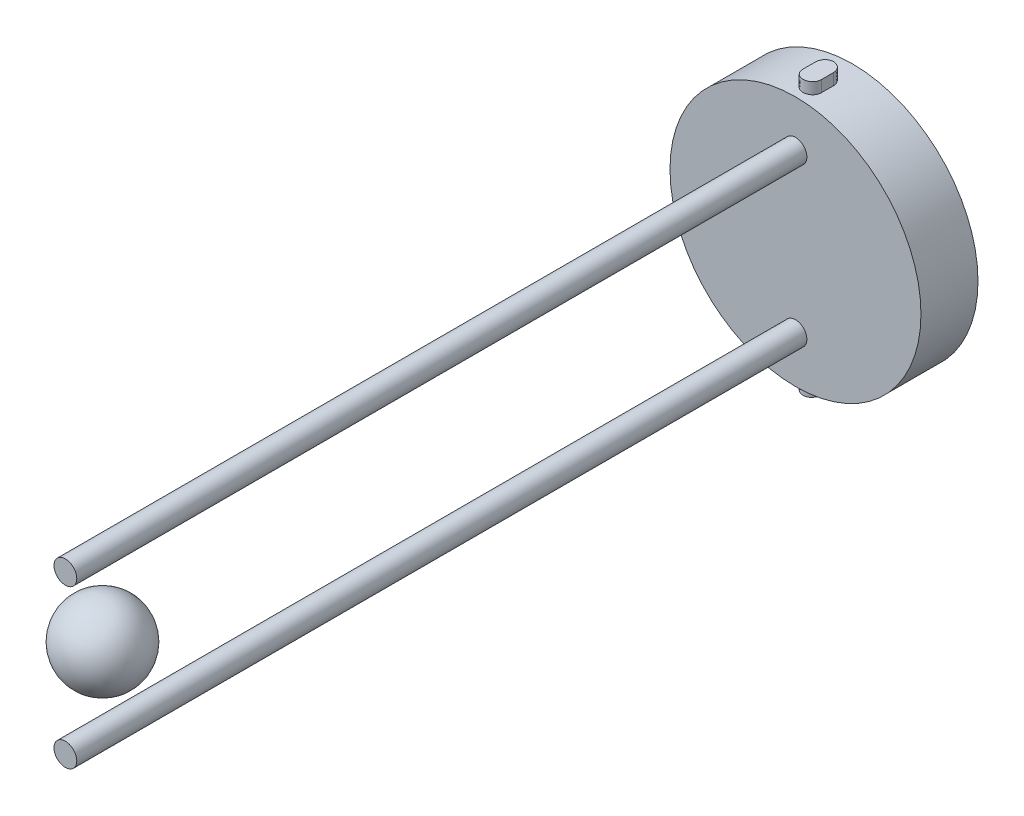
ISO-10303-21;
HEADER;
FILE_DESCRIPTION(('STEP AP214'),'2;1');
FILE_NAME('part.step','',(''),(''),'','','');
FILE_SCHEMA(('AUTOMOTIVE_DESIGN { 1 0 10303 214 1 1 1 1 }'));
ENDSEC;
DATA;
#1=APPLICATION_CONTEXT('core data for automotive mechanical design processes');
#2=APPLICATION_PROTOCOL_DEFINITION('international standard','automotive_design',2000,#1);
#3=PRODUCT_CONTEXT('',#1,'mechanical');
#4=PRODUCT('Part','Part','',(#3));
#5=PRODUCT_RELATED_PRODUCT_CATEGORY('part','',(#4));
#6=PRODUCT_DEFINITION_FORMATION('','',#4);
#7=PRODUCT_DEFINITION_CONTEXT('part definition',#1,'design');
#8=PRODUCT_DEFINITION('design','',#6,#7);
#9=PRODUCT_DEFINITION_SHAPE('','',#8);
#10=(LENGTH_UNIT() NAMED_UNIT(*) SI_UNIT(.MILLI.,.METRE.));
#11=(NAMED_UNIT(*) PLANE_ANGLE_UNIT() SI_UNIT($,.RADIAN.));
#12=(NAMED_UNIT(*) SI_UNIT($,.STERADIAN.) SOLID_ANGLE_UNIT());
#13=UNCERTAINTY_MEASURE_WITH_UNIT(LENGTH_MEASURE(1.E-05),#10,'distance_accuracy_value','');
#14=(GEOMETRIC_REPRESENTATION_CONTEXT(3) GLOBAL_UNCERTAINTY_ASSIGNED_CONTEXT((#13)) GLOBAL_UNIT_ASSIGNED_CONTEXT((#10,
#11,#12)) REPRESENTATION_CONTEXT('',''));
#15=CARTESIAN_POINT('',(0.,0.,0.));
#16=DIRECTION('',(0.,0.,1.));
#17=DIRECTION('',(1.,0.,0.));
#18=AXIS2_PLACEMENT_3D('',#15,#16,#17);
#19=CARTESIAN_POINT('',(0.,0.,303.742089952953));
#20=DIRECTION('',(0.,1.,0.));
#21=DIRECTION('',(0.,0.,-1.));
#22=AXIS2_PLACEMENT_3D('',#19,#20,#21);
#23=SPHERICAL_SURFACE('',#22,17.5);
#24=CARTESIAN_POINT('',(0.,17.5,303.742089952953));
#25=VERTEX_POINT('',#24);
#26=VERTEX_LOOP('',#25);
#27=FACE_BOUND('',#26,.T.);
#28=ADVANCED_FACE('F56',(#27),#23,.T.);
#29=CLOSED_SHELL('',(#28));
#30=MANIFOLD_SOLID_BREP('B2',#29);
#31=CARTESIAN_POINT('',(0.,34.6,320.));
#32=DIRECTION('',(0.,0.,-1.));
#33=DIRECTION('',(-1.,0.,0.));
#34=AXIS2_PLACEMENT_3D('',#31,#32,#33);
#35=CYLINDRICAL_SURFACE('',#34,5.);
#36=CARTESIAN_POINT('',(0.,34.6,320.));
#37=DIRECTION('',(0.,0.,1.));
#38=DIRECTION('',(1.,0.,0.));
#39=AXIS2_PLACEMENT_3D('',#36,#37,#38);
#40=CIRCLE('',#39,5.);
#41=CARTESIAN_POINT('',(5.,34.6,320.));
#42=VERTEX_POINT('',#41);
#43=EDGE_CURVE('E81',#42,#42,#40,.T.);
#44=ORIENTED_EDGE('',*,*,#43,.F.);
#45=EDGE_LOOP('',(#44));
#46=FACE_BOUND('',#45,.T.);
#47=CARTESIAN_POINT('',(0.,34.6,0.));
#48=DIRECTION('',(0.,0.,1.));
#49=DIRECTION('',(1.,0.,0.));
#50=AXIS2_PLACEMENT_3D('',#47,#48,#49);
#51=CIRCLE('',#50,5.);
#52=CARTESIAN_POINT('',(5.,34.6,0.));
#53=VERTEX_POINT('',#52);
#54=EDGE_CURVE('E55',#53,#53,#51,.T.);
#55=ORIENTED_EDGE('',*,*,#54,.T.);
#56=EDGE_LOOP('',(#55));
#57=FACE_BOUND('',#56,.T.);
#58=ADVANCED_FACE('F77',(#46,#57),#35,.T.);
#59=CARTESIAN_POINT('',(0.,34.6,320.));
#60=DIRECTION('',(0.,0.,1.));
#61=DIRECTION('',(1.,0.,0.));
#62=AXIS2_PLACEMENT_3D('',#59,#60,#61);
#63=PLANE('',#62);
#64=ORIENTED_EDGE('',*,*,#43,.T.);
#65=EDGE_LOOP('',(#64));
#66=FACE_BOUND('',#65,.T.);
#67=ADVANCED_FACE('F79',(#66),#63,.T.);
#68=CARTESIAN_POINT('',(0.,34.6,0.));
#69=DIRECTION('',(0.,0.,1.));
#70=DIRECTION('',(1.,0.,0.));
#71=AXIS2_PLACEMENT_3D('',#68,#69,#70);
#72=PLANE('',#71);
#73=ORIENTED_EDGE('',*,*,#54,.F.);
#74=EDGE_LOOP('',(#73));
#75=FACE_BOUND('',#74,.T.);
#76=ADVANCED_FACE('F96',(#75),#72,.F.);
#77=CLOSED_SHELL('',(#58,#67,#76));
#78=MANIFOLD_SOLID_BREP('B6',#77);
#79=CARTESIAN_POINT('',(0.,-34.6,320.));
#80=DIRECTION('',(0.,0.,-1.));
#81=DIRECTION('',(-1.,0.,0.));
#82=AXIS2_PLACEMENT_3D('',#79,#80,#81);
#83=CYLINDRICAL_SURFACE('',#82,5.);
#84=CARTESIAN_POINT('',(0.,-34.6,320.));
#85=DIRECTION('',(0.,0.,1.));
#86=DIRECTION('',(1.,0.,0.));
#87=AXIS2_PLACEMENT_3D('',#84,#85,#86);
#88=CIRCLE('',#87,5.);
#89=CARTESIAN_POINT('',(5.,-34.6,320.));
#90=VERTEX_POINT('',#89);
#91=EDGE_CURVE('E76',#90,#90,#88,.T.);
#92=ORIENTED_EDGE('',*,*,#91,.F.);
#93=EDGE_LOOP('',(#92));
#94=FACE_BOUND('',#93,.T.);
#95=CARTESIAN_POINT('',(0.,-34.6,0.));
#96=DIRECTION('',(0.,0.,1.));
#97=DIRECTION('',(1.,0.,0.));
#98=AXIS2_PLACEMENT_3D('',#95,#96,#97);
#99=CIRCLE('',#98,5.);
#100=CARTESIAN_POINT('',(5.,-34.6,0.));
#101=VERTEX_POINT('',#100);
#102=EDGE_CURVE('E130',#101,#101,#99,.T.);
#103=ORIENTED_EDGE('',*,*,#102,.T.);
#104=EDGE_LOOP('',(#103));
#105=FACE_BOUND('',#104,.T.);
#106=ADVANCED_FACE('F127',(#94,#105),#83,.T.);
#107=CARTESIAN_POINT('',(0.,-34.6,320.));
#108=DIRECTION('',(0.,0.,1.));
#109=DIRECTION('',(1.,0.,0.));
#110=AXIS2_PLACEMENT_3D('',#107,#108,#109);
#111=PLANE('',#110);
#112=ORIENTED_EDGE('',*,*,#91,.T.);
#113=EDGE_LOOP('',(#112));
#114=FACE_BOUND('',#113,.T.);
#115=ADVANCED_FACE('F142',(#114),#111,.T.);
#116=CARTESIAN_POINT('',(0.,-34.6,0.));
#117=DIRECTION('',(0.,0.,1.));
#118=DIRECTION('',(1.,0.,0.));
#119=AXIS2_PLACEMENT_3D('',#116,#117,#118);
#120=PLANE('',#119);
#121=ORIENTED_EDGE('',*,*,#102,.F.);
#122=EDGE_LOOP('',(#121));
#123=FACE_BOUND('',#122,.T.);
#124=ADVANCED_FACE('F140',(#123),#120,.F.);
#125=CLOSED_SHELL('',(#106,#115,#124));
#126=MANIFOLD_SOLID_BREP('B50',#125);
#127=CARTESIAN_POINT('',(0.,0.,-25.));
#128=DIRECTION('',(0.,0.,1.));
#129=DIRECTION('',(1.,0.,0.));
#130=AXIS2_PLACEMENT_3D('',#127,#128,#129);
#131=CYLINDRICAL_SURFACE('',#130,55.);
#132=CARTESIAN_POINT('',(0.,0.,-25.));
#133=DIRECTION('',(0.,0.,1.));
#134=DIRECTION('',(1.,0.,0.));
#135=AXIS2_PLACEMENT_3D('',#132,#133,#134);
#136=CIRCLE('',#135,55.);
#137=CARTESIAN_POINT('',(55.,0.,-25.));
#138=VERTEX_POINT('',#137);
#139=EDGE_CURVE('E398',#138,#138,#136,.T.);
#140=ORIENTED_EDGE('',*,*,#139,.T.);
#141=EDGE_LOOP('',(#140));
#142=FACE_BOUND('',#141,.T.);
#143=CARTESIAN_POINT('',(0.,0.,0.));
#144=DIRECTION('',(0.,0.,1.));
#145=DIRECTION('',(1.,0.,0.));
#146=AXIS2_PLACEMENT_3D('',#143,#144,#145);
#147=CIRCLE('',#146,55.);
#148=CARTESIAN_POINT('',(55.,0.,0.));
#149=VERTEX_POINT('',#148);
#150=EDGE_CURVE('E402',#149,#149,#147,.T.);
#151=ORIENTED_EDGE('',*,*,#150,.F.);
#152=EDGE_LOOP('',(#151));
#153=FACE_BOUND('',#152,.T.);
#154=DIRECTION('',(0.,0.,1.));
#155=VECTOR('',#154,1.);
#156=CARTESIAN_POINT('',(-4.,54.8543526076099,-25.));
#157=LINE('',#156,#155);
#158=CARTESIAN_POINT('',(-4.,54.8543526076099,-12.7));
#159=VERTEX_POINT('',#158);
#160=CARTESIAN_POINT('',(-4.,54.8543526076099,-7.3));
#161=VERTEX_POINT('',#160);
#162=EDGE_CURVE('E404',#159,#161,#157,.T.);
#163=ORIENTED_EDGE('',*,*,#162,.F.);
#164=CARTESIAN_POINT('',(-4.,54.8543526076099,-12.7));
#165=CARTESIAN_POINT('',(-4.00000056672415,54.8543504774455,-12.8126722163692));
#166=CARTESIAN_POINT('',(-3.99507121010974,54.8547122485377,-12.9252808662775));
#167=CARTESIAN_POINT('',(-3.97557866569771,54.8561292418757,-13.1496251797999));
#168=CARTESIAN_POINT('',(-3.96101836611814,54.8571842562245,-13.2613610949768));
#169=CARTESIAN_POINT('',(-3.90323107735579,54.8613375963018,-13.594210147639));
#170=CARTESIAN_POINT('',(-3.84589756430043,54.8654242388308,-13.8129985510018));
#171=CARTESIAN_POINT('',(-3.69600970860131,54.8757240821392,-14.2378328671244));
#172=CARTESIAN_POINT('',(-3.60349067054277,54.8819351506773,-14.4438913127874));
#173=CARTESIAN_POINT('',(-3.44032675306294,54.8923226553671,-14.7391483445261));
#174=CARTESIAN_POINT('',(-3.38186987394246,54.8959639172437,-14.8352681575801));
#175=CARTESIAN_POINT('',(-3.25709892630358,54.9035082730666,-15.0222872599664));
#176=CARTESIAN_POINT('',(-3.19078478883397,54.9074113693106,-15.1131865034752));
#177=CARTESIAN_POINT('',(-3.04977526339155,54.9154251031826,-15.2901067043995));
#178=CARTESIAN_POINT('',(-2.97498582300925,54.9195377194603,-15.3760528537804));
#179=CARTESIAN_POINT('',(-2.85737342418829,54.9257404033412,-15.4997690155483));
#180=CARTESIAN_POINT('',(-2.81726086598397,54.9278137727172,-15.540143839011));
#181=CARTESIAN_POINT('',(-2.73526099080439,54.9319582142636,-15.6190492681825));
#182=CARTESIAN_POINT('',(-2.69337365625283,54.9340292864109,-15.6575798556191));
#183=CARTESIAN_POINT('',(-2.56518988110449,54.9402139588199,-15.7703686742292));
#184=CARTESIAN_POINT('',(-2.47638348659233,54.9442983847566,-15.8418115538294));
#185=CARTESIAN_POINT('',(-2.29299246453917,54.9522577625814,-15.9767969555767));
#186=CARTESIAN_POINT('',(-2.19840725717915,54.956132693376,-16.0403386830112));
#187=CARTESIAN_POINT('',(-1.91362019373077,54.9670191554454,-16.2147308816209));
#188=CARTESIAN_POINT('',(-1.71645865415032,54.9735883404177,-16.3144827129786));
#189=CARTESIAN_POINT('',(-1.30871896681587,54.9848051562261,-16.4813356595435));
#190=CARTESIAN_POINT('',(-1.09814096967245,54.9894528086285,-16.5484371412043));
#191=CARTESIAN_POINT('',(-0.771200583814921,54.9947087867214,-16.6240199301896));
#192=CARTESIAN_POINT('',(-0.657664364243288,54.9961869267483,-16.6452027843167));
#193=CARTESIAN_POINT('',(-0.429129905714038,54.9984442068781,-16.6775871135493));
#194=CARTESIAN_POINT('',(-0.314131807071677,54.9992234135605,-16.6887895393762));
#195=CARTESIAN_POINT('',(-0.141284721682881,54.9998488181352,-16.6978076559273));
#196=CARTESIAN_POINT('',(-0.0836144644713849,54.9999667287462,-16.6995162496846));
#197=CARTESIAN_POINT('',(0.031744244860507,55.0000210416201,-16.7003078590608));
#198=CARTESIAN_POINT('',(0.0894326960003504,54.9999574523983,-16.6993909978555));
#199=CARTESIAN_POINT('',(0.262337158727955,54.9994952162852,-16.6927962428766));
#200=CARTESIAN_POINT('',(0.377412238673912,54.9988251727011,-16.6832751881711));
#201=CARTESIAN_POINT('',(0.70949182720131,54.995852368235,-16.6411186304685));
#202=CARTESIAN_POINT('',(0.924950638272594,54.9926226081913,-16.5953881313805));
#203=CARTESIAN_POINT('',(1.34565022275807,54.9839402221634,-16.4698983856979));
#204=CARTESIAN_POINT('',(1.55088362171972,54.9784860172471,-16.3901149661395));
#205=CARTESIAN_POINT('',(1.95308868560063,54.965691734329,-16.1950829201239));
#206=CARTESIAN_POINT('',(2.14949864558792,54.9582909438267,-16.078663140461));
#207=CARTESIAN_POINT('',(2.42689234402684,54.9465089425902,-15.8805159466622));
#208=CARTESIAN_POINT('',(2.51649365929862,54.9424677632523,-15.8105402741481));
#209=CARTESIAN_POINT('',(2.68928547069909,54.9342807491719,-15.6630421506369));
#210=CARTESIAN_POINT('',(2.77247634642884,54.9301349206457,-15.58552014712));
#211=CARTESIAN_POINT('',(2.93061237915772,54.9219236852082,-15.424710713225));
#212=CARTESIAN_POINT('',(3.00566050717767,54.9178579900913,-15.3415244201237));
#213=CARTESIAN_POINT('',(3.14846952912183,54.9098556504074,-15.1691363405149));
#214=CARTESIAN_POINT('',(3.2162299992097,54.9059190133553,-15.0799342046277));
#215=CARTESIAN_POINT('',(3.40800645629464,54.8944618526691,-14.8041276203908));
#216=CARTESIAN_POINT('',(3.52051457873057,54.8872942370523,-14.6093259706574));
#217=CARTESIAN_POINT('',(3.71201135409968,54.8746780908036,-14.2030453310178));
#218=CARTESIAN_POINT('',(3.7908872274527,54.8692353596767,-13.9915130051315));
#219=CARTESIAN_POINT('',(3.88188288944863,54.8628458202295,-13.6669360971891));
#220=CARTESIAN_POINT('',(3.90765690093102,54.8610121121512,-13.5575758894021));
#221=CARTESIAN_POINT('',(3.94992461242602,54.8579853893995,-13.3370856510678));
#222=CARTESIAN_POINT('',(3.96642310907676,54.8567920435906,-13.2259565658904));
#223=CARTESIAN_POINT('',(3.98544526811387,54.8554124492599,-13.0454932339638));
#224=CARTESIAN_POINT('',(3.99090119277345,54.8550155297914,-12.9764545584525));
#225=CARTESIAN_POINT('',(3.99817626461995,54.8544856148281,-12.8382805745522));
#226=CARTESIAN_POINT('',(4.0000004207912,54.8543522558289,-12.769145531043));
#227=CARTESIAN_POINT('',(4.,54.8543526076099,-12.7));
#228=B_SPLINE_CURVE_WITH_KNOTS('',3,(#164,#165,#166,#167,#168,#169,#170,#171,#172,#173,#174,
#175,#176,#177,#178,#179,#180,#181,#182,#183,#184,#185,#186,#187,#188,#189,#190,#191,#192,#193,
#194,#195,#196,#197,#198,#199,#200,#201,#202,#203,#204,#205,#206,#207,#208,#209,#210,#211,#212,
#213,#214,#215,#216,#217,#218,#219,#220,#221,#222,#223,#224,#225,#226,#227),.UNSPECIFIED.,.F.,
.F.,(4,2,2,2,2,2,2,2,2,2,2,2,2,2,2,2,2,2,2,2,2,2,2,2,2,2,2,2,2,2,2,4),(0.,0.337790516054858,
0.675479778202454,1.35075776445657,2.02535996778583,2.3627057625915,2.70005451798731,
3.04160249836963,3.21240615423371,3.38321150202863,3.7248734571725,4.06656974955394,
4.72671026684909,5.3868433748387,5.73299635313448,6.0791163538626,6.25215385551558,
6.42518323907807,6.77118228743956,7.42881502120795,8.08691536364466,8.76865872622751,
9.1095889776559,9.45049902499412,9.78641322131741,10.1223469432199,10.7942267253284,
11.4683421447998,11.8051307261913,12.1417449838465,12.3494237077138,12.5568157992934),.UNSPECIFIED.);
#229=CARTESIAN_POINT('',(4.,54.8543526076099,-12.7));
#230=VERTEX_POINT('',#229);
#231=EDGE_CURVE('E172',#159,#230,#228,.T.);
#232=ORIENTED_EDGE('',*,*,#231,.T.);
#233=DIRECTION('',(0.,0.,1.));
#234=VECTOR('',#233,1.);
#235=CARTESIAN_POINT('',(4.,54.8543526076099,-25.));
#236=LINE('',#235,#234);
#237=CARTESIAN_POINT('',(4.,54.8543526076099,-7.3));
#238=VERTEX_POINT('',#237);
#239=EDGE_CURVE('E462',#230,#238,#236,.T.);
#240=ORIENTED_EDGE('',*,*,#239,.T.);
#241=CARTESIAN_POINT('',(4.,54.8543526076099,-7.3));
#242=CARTESIAN_POINT('',(4.00000056672415,54.8543504774454,-7.18732778363075));
#243=CARTESIAN_POINT('',(3.99507121010974,54.8547122485377,-7.07471913372255));
#244=CARTESIAN_POINT('',(3.97557866569771,54.8561292418757,-6.85037482020007));
#245=CARTESIAN_POINT('',(3.96101836611814,54.8571842562245,-6.7386389050232));
#246=CARTESIAN_POINT('',(3.90323107735578,54.8613375963018,-6.40578985236101));
#247=CARTESIAN_POINT('',(3.84589756430042,54.8654242388308,-6.18700144899824));
#248=CARTESIAN_POINT('',(3.6960097086013,54.8757240821391,-5.76216713287554));
#249=CARTESIAN_POINT('',(3.60349067054276,54.8819351506773,-5.55610868721255));
#250=CARTESIAN_POINT('',(3.44032675306293,54.8923226553671,-5.26085165547387));
#251=CARTESIAN_POINT('',(3.38186987394245,54.8959639172437,-5.16473184241986));
#252=CARTESIAN_POINT('',(3.25709892630356,54.9035082730666,-4.97771274003362));
#253=CARTESIAN_POINT('',(3.19078478883395,54.9074113693106,-4.88681349652477));
#254=CARTESIAN_POINT('',(3.04977526339154,54.9154251031826,-4.70989329560047));
#255=CARTESIAN_POINT('',(2.97498582300924,54.9195377194603,-4.62394714621956));
#256=CARTESIAN_POINT('',(2.85737342418828,54.9257404033412,-4.50023098445164));
#257=CARTESIAN_POINT('',(2.81726086598395,54.9278137727172,-4.45985616098902));
#258=CARTESIAN_POINT('',(2.73526099080437,54.9319582142636,-4.3809507318175));
#259=CARTESIAN_POINT('',(2.69337365625282,54.9340292864109,-4.34242014438085));
#260=CARTESIAN_POINT('',(2.56518988110448,54.9402139588199,-4.2296313257708));
#261=CARTESIAN_POINT('',(2.47638348659232,54.9442983847566,-4.15818844617056));
#262=CARTESIAN_POINT('',(2.29299246453916,54.9522577625814,-4.02320304442333));
#263=CARTESIAN_POINT('',(2.19840725717915,54.956132693376,-3.95966131698875));
#264=CARTESIAN_POINT('',(1.91362019373076,54.9670191554454,-3.78526911837914));
#265=CARTESIAN_POINT('',(1.71645865415031,54.9735883404177,-3.68551728702143));
#266=CARTESIAN_POINT('',(1.30871896681586,54.9848051562261,-3.51866434045647));
#267=CARTESIAN_POINT('',(1.09814096967244,54.9894528086285,-3.45156285879566));
#268=CARTESIAN_POINT('',(0.771200583814911,54.9947087867214,-3.37598006981036));
#269=CARTESIAN_POINT('',(0.657664364243277,54.9961869267483,-3.3547972156833));
#270=CARTESIAN_POINT('',(0.429129905714027,54.9984442068781,-3.3224128864507));
#271=CARTESIAN_POINT('',(0.314131807071666,54.9992234135605,-3.31121046062376));
#272=CARTESIAN_POINT('',(0.141284721682869,54.9998488181352,-3.30219234407273));
#273=CARTESIAN_POINT('',(0.0836144644713724,54.9999667287462,-3.30048375031543));
#274=CARTESIAN_POINT('',(-0.0317442448605198,55.0000210416201,-3.29969214093922));
#275=CARTESIAN_POINT('',(-0.0894326960003635,54.9999574523983,-3.30060900214453));
#276=CARTESIAN_POINT('',(-0.262337158727968,54.9994952162852,-3.30720375712337));
#277=CARTESIAN_POINT('',(-0.377412238673926,54.998825172701,-3.31672481182894));
#278=CARTESIAN_POINT('',(-0.709491827201328,54.995852368235,-3.35888136953146));
#279=CARTESIAN_POINT('',(-0.924950638272614,54.9926226081913,-3.40461186861951));
#280=CARTESIAN_POINT('',(-1.3456502227581,54.9839402221634,-3.53010161430215));
#281=CARTESIAN_POINT('',(-1.55088362171974,54.9784860172471,-3.60988503386054));
#282=CARTESIAN_POINT('',(-1.95308868560066,54.965691734329,-3.80491707987612));
#283=CARTESIAN_POINT('',(-2.14949864558795,54.9582909438267,-3.921336859539));
#284=CARTESIAN_POINT('',(-2.42689234402685,54.9465089425902,-4.11948405333779));
#285=CARTESIAN_POINT('',(-2.51649365929863,54.9424677632523,-4.1894597258519));
#286=CARTESIAN_POINT('',(-2.6892854706991,54.9342807491719,-4.33695784936316));
#287=CARTESIAN_POINT('',(-2.77247634642885,54.9301349206457,-4.41447985287999));
#288=CARTESIAN_POINT('',(-2.93061237915773,54.9219236852082,-4.575289286775));
#289=CARTESIAN_POINT('',(-3.00566050717768,54.9178579900913,-4.6584755798763));
#290=CARTESIAN_POINT('',(-3.14846952912184,54.9098556504074,-4.83086365948515));
#291=CARTESIAN_POINT('',(-3.21622999920971,54.9059190133553,-4.92006579537234));
#292=CARTESIAN_POINT('',(-3.40800645629465,54.8944618526691,-5.19587237960919));
#293=CARTESIAN_POINT('',(-3.52051457873057,54.8872942370523,-5.39067402934262));
#294=CARTESIAN_POINT('',(-3.71201135409969,54.8746780908036,-5.7969546689822));
#295=CARTESIAN_POINT('',(-3.7908872274527,54.8692353596767,-6.00848699486852));
#296=CARTESIAN_POINT('',(-3.88188288944863,54.8628458202295,-6.3330639028109));
#297=CARTESIAN_POINT('',(-3.90765690093102,54.8610121121513,-6.44242411059788));
#298=CARTESIAN_POINT('',(-3.94992461242602,54.8579853893995,-6.66291434893219));
#299=CARTESIAN_POINT('',(-3.96642310907677,54.8567920435906,-6.77404343410959));
#300=CARTESIAN_POINT('',(-3.98544526811387,54.8554124492599,-6.95450676603621));
#301=CARTESIAN_POINT('',(-3.99090119277345,54.8550155297914,-7.02354544154748));
#302=CARTESIAN_POINT('',(-3.99817626461995,54.8544856148281,-7.16171942544783));
#303=CARTESIAN_POINT('',(-4.0000004207912,54.8543522558289,-7.23085446895697));
#304=CARTESIAN_POINT('',(-4.,54.8543526076099,-7.3));
#305=B_SPLINE_CURVE_WITH_KNOTS('',3,(#241,#242,#243,#244,#245,#246,#247,#248,#249,#250,#251,
#252,#253,#254,#255,#256,#257,#258,#259,#260,#261,#262,#263,#264,#265,#266,#267,#268,#269,#270,
#271,#272,#273,#274,#275,#276,#277,#278,#279,#280,#281,#282,#283,#284,#285,#286,#287,#288,#289,
#290,#291,#292,#293,#294,#295,#296,#297,#298,#299,#300,#301,#302,#303,#304),.UNSPECIFIED.,.F.,
.F.,(4,2,2,2,2,2,2,2,2,2,2,2,2,2,2,2,2,2,2,2,2,2,2,2,2,2,2,2,2,2,2,4),(0.,0.337790516054861,
0.675479778202461,1.35075776445658,2.02535996778584,2.36270576259152,2.70005451798733,
3.04160249836965,3.21240615423373,3.38321150202865,3.72487345717251,4.06656974955395,
4.7267102668491,5.38684337483871,5.73299635313449,6.07911635386261,6.25215385551559,
6.42518323907809,6.77118228743958,7.42881502120798,8.08691536364469,8.76865872622754,
9.10958897765592,9.45049902499413,9.78641322131742,10.12234694322,10.7942267253284,
11.4683421447998,11.8051307261913,12.1417449838465,12.3494237077138,12.5568157992934),.UNSPECIFIED.);
#306=EDGE_CURVE('E387',#238,#161,#305,.T.);
#307=ORIENTED_EDGE('',*,*,#306,.T.);
#308=EDGE_LOOP('',(#163,#232,#240,#307));
#309=FACE_BOUND('',#308,.T.);
#310=DIRECTION('',(0.,0.,1.));
#311=VECTOR('',#310,1.);
#312=CARTESIAN_POINT('',(4.,-54.8543526076099,-25.));
#313=LINE('',#312,#311);
#314=CARTESIAN_POINT('',(4.,-54.8543526076099,-12.7));
#315=VERTEX_POINT('',#314);
#316=CARTESIAN_POINT('',(4.,-54.8543526076099,-7.3));
#317=VERTEX_POINT('',#316);
#318=EDGE_CURVE('E248',#315,#317,#313,.T.);
#319=ORIENTED_EDGE('',*,*,#318,.F.);
#320=CARTESIAN_POINT('',(4.,-54.8543526076099,-12.7));
#321=CARTESIAN_POINT('',(4.00000056672415,-54.8543504774455,-12.8126722163692));
#322=CARTESIAN_POINT('',(3.99507121010974,-54.8547122485377,-12.9252808662775));
#323=CARTESIAN_POINT('',(3.97557866569771,-54.8561292418757,-13.1496251797999));
#324=CARTESIAN_POINT('',(3.96101836611814,-54.8571842562245,-13.2613610949768));
#325=CARTESIAN_POINT('',(3.90323107735579,-54.8613375963018,-13.594210147639));
#326=CARTESIAN_POINT('',(3.84589756430043,-54.8654242388308,-13.8129985510018));
#327=CARTESIAN_POINT('',(3.69600970860131,-54.8757240821392,-14.2378328671244));
#328=CARTESIAN_POINT('',(3.60349067054277,-54.8819351506773,-14.4438913127874));
#329=CARTESIAN_POINT('',(3.44032675306294,-54.8923226553671,-14.7391483445261));
#330=CARTESIAN_POINT('',(3.38186987394246,-54.8959639172437,-14.8352681575801));
#331=CARTESIAN_POINT('',(3.25709892630358,-54.9035082730666,-15.0222872599664));
#332=CARTESIAN_POINT('',(3.19078478883397,-54.9074113693106,-15.1131865034752));
#333=CARTESIAN_POINT('',(3.04977526339155,-54.9154251031826,-15.2901067043995));
#334=CARTESIAN_POINT('',(2.97498582300925,-54.9195377194603,-15.3760528537804));
#335=CARTESIAN_POINT('',(2.85737342418829,-54.9257404033412,-15.4997690155483));
#336=CARTESIAN_POINT('',(2.81726086598397,-54.9278137727172,-15.540143839011));
#337=CARTESIAN_POINT('',(2.73526099080439,-54.9319582142636,-15.6190492681825));
#338=CARTESIAN_POINT('',(2.69337365625283,-54.9340292864109,-15.6575798556191));
#339=CARTESIAN_POINT('',(2.56518988110449,-54.9402139588199,-15.7703686742292));
#340=CARTESIAN_POINT('',(2.47638348659233,-54.9442983847566,-15.8418115538294));
#341=CARTESIAN_POINT('',(2.29299246453917,-54.9522577625814,-15.9767969555767));
#342=CARTESIAN_POINT('',(2.19840725717915,-54.956132693376,-16.0403386830112));
#343=CARTESIAN_POINT('',(1.91362019373077,-54.9670191554454,-16.2147308816209));
#344=CARTESIAN_POINT('',(1.71645865415032,-54.9735883404177,-16.3144827129786));
#345=CARTESIAN_POINT('',(1.30871896681587,-54.9848051562261,-16.4813356595435));
#346=CARTESIAN_POINT('',(1.09814096967245,-54.9894528086285,-16.5484371412043));
#347=CARTESIAN_POINT('',(0.771200583814921,-54.9947087867214,-16.6240199301896));
#348=CARTESIAN_POINT('',(0.657664364243288,-54.9961869267483,-16.6452027843167));
#349=CARTESIAN_POINT('',(0.429129905714038,-54.9984442068781,-16.6775871135493));
#350=CARTESIAN_POINT('',(0.314131807071677,-54.9992234135605,-16.6887895393762));
#351=CARTESIAN_POINT('',(0.141284721682881,-54.9998488181352,-16.6978076559273));
#352=CARTESIAN_POINT('',(0.0836144644713849,-54.9999667287462,-16.6995162496846));
#353=CARTESIAN_POINT('',(-0.031744244860507,-55.0000210416201,-16.7003078590608));
#354=CARTESIAN_POINT('',(-0.0894326960003504,-54.9999574523983,-16.6993909978555));
#355=CARTESIAN_POINT('',(-0.262337158727955,-54.9994952162852,-16.6927962428766));
#356=CARTESIAN_POINT('',(-0.377412238673912,-54.9988251727011,-16.6832751881711));
#357=CARTESIAN_POINT('',(-0.70949182720131,-54.995852368235,-16.6411186304685));
#358=CARTESIAN_POINT('',(-0.924950638272594,-54.9926226081913,-16.5953881313805));
#359=CARTESIAN_POINT('',(-1.34565022275807,-54.9839402221634,-16.4698983856979));
#360=CARTESIAN_POINT('',(-1.55088362171972,-54.9784860172471,-16.3901149661395));
#361=CARTESIAN_POINT('',(-1.95308868560063,-54.965691734329,-16.1950829201239));
#362=CARTESIAN_POINT('',(-2.14949864558792,-54.9582909438267,-16.078663140461));
#363=CARTESIAN_POINT('',(-2.42689234402684,-54.9465089425902,-15.8805159466622));
#364=CARTESIAN_POINT('',(-2.51649365929862,-54.9424677632523,-15.8105402741481));
#365=CARTESIAN_POINT('',(-2.68928547069909,-54.9342807491719,-15.6630421506369));
#366=CARTESIAN_POINT('',(-2.77247634642884,-54.9301349206457,-15.58552014712));
#367=CARTESIAN_POINT('',(-2.93061237915772,-54.9219236852082,-15.424710713225));
#368=CARTESIAN_POINT('',(-3.00566050717767,-54.9178579900913,-15.3415244201237));
#369=CARTESIAN_POINT('',(-3.14846952912183,-54.9098556504074,-15.1691363405149));
#370=CARTESIAN_POINT('',(-3.2162299992097,-54.9059190133553,-15.0799342046277));
#371=CARTESIAN_POINT('',(-3.40800645629464,-54.8944618526691,-14.8041276203908));
#372=CARTESIAN_POINT('',(-3.52051457873057,-54.8872942370523,-14.6093259706574));
#373=CARTESIAN_POINT('',(-3.71201135409968,-54.8746780908036,-14.2030453310178));
#374=CARTESIAN_POINT('',(-3.7908872274527,-54.8692353596767,-13.9915130051315));
#375=CARTESIAN_POINT('',(-3.88188288944863,-54.8628458202295,-13.6669360971891));
#376=CARTESIAN_POINT('',(-3.90765690093102,-54.8610121121512,-13.5575758894021));
#377=CARTESIAN_POINT('',(-3.94992461242602,-54.8579853893995,-13.3370856510678));
#378=CARTESIAN_POINT('',(-3.96642310907676,-54.8567920435906,-13.2259565658904));
#379=CARTESIAN_POINT('',(-3.98544526811387,-54.8554124492599,-13.0454932339638));
#380=CARTESIAN_POINT('',(-3.99090119277345,-54.8550155297914,-12.9764545584525));
#381=CARTESIAN_POINT('',(-3.99817626461995,-54.8544856148281,-12.8382805745522));
#382=CARTESIAN_POINT('',(-4.0000004207912,-54.8543522558289,-12.769145531043));
#383=CARTESIAN_POINT('',(-4.,-54.8543526076099,-12.7));
#384=B_SPLINE_CURVE_WITH_KNOTS('',3,(#320,#321,#322,#323,#324,#325,#326,#327,#328,#329,#330,
#331,#332,#333,#334,#335,#336,#337,#338,#339,#340,#341,#342,#343,#344,#345,#346,#347,#348,#349,
#350,#351,#352,#353,#354,#355,#356,#357,#358,#359,#360,#361,#362,#363,#364,#365,#366,#367,#368,
#369,#370,#371,#372,#373,#374,#375,#376,#377,#378,#379,#380,#381,#382,#383),.UNSPECIFIED.,.F.,
.F.,(4,2,2,2,2,2,2,2,2,2,2,2,2,2,2,2,2,2,2,2,2,2,2,2,2,2,2,2,2,2,2,4),(0.,0.337790516054858,
0.675479778202454,1.35075776445657,2.02535996778583,2.3627057625915,2.70005451798731,
3.04160249836963,3.21240615423371,3.38321150202863,3.7248734571725,4.06656974955394,
4.72671026684909,5.3868433748387,5.73299635313448,6.0791163538626,6.25215385551558,
6.42518323907807,6.77118228743956,7.42881502120795,8.08691536364466,8.76865872622751,
9.1095889776559,9.45049902499412,9.78641322131741,10.1223469432199,10.7942267253284,
11.4683421447998,11.8051307261913,12.1417449838465,12.3494237077138,12.5568157992934),.UNSPECIFIED.);
#385=CARTESIAN_POINT('',(-4.,-54.8543526076099,-12.7));
#386=VERTEX_POINT('',#385);
#387=EDGE_CURVE('E190',#315,#386,#384,.T.);
#388=ORIENTED_EDGE('',*,*,#387,.T.);
#389=DIRECTION('',(0.,0.,1.));
#390=VECTOR('',#389,1.);
#391=CARTESIAN_POINT('',(-4.,-54.8543526076099,-25.));
#392=LINE('',#391,#390);
#393=CARTESIAN_POINT('',(-4.,-54.8543526076099,-7.3));
#394=VERTEX_POINT('',#393);
#395=EDGE_CURVE('E194',#386,#394,#392,.T.);
#396=ORIENTED_EDGE('',*,*,#395,.T.);
#397=CARTESIAN_POINT('',(-4.,-54.8543526076099,-7.3));
#398=CARTESIAN_POINT('',(-4.00000056672415,-54.8543504774454,-7.18732778363075));
#399=CARTESIAN_POINT('',(-3.99507121010974,-54.8547122485377,-7.07471913372255));
#400=CARTESIAN_POINT('',(-3.97557866569771,-54.8561292418757,-6.85037482020007));
#401=CARTESIAN_POINT('',(-3.96101836611814,-54.8571842562245,-6.7386389050232));
#402=CARTESIAN_POINT('',(-3.90323107735578,-54.8613375963018,-6.40578985236101));
#403=CARTESIAN_POINT('',(-3.84589756430042,-54.8654242388308,-6.18700144899824));
#404=CARTESIAN_POINT('',(-3.6960097086013,-54.8757240821391,-5.76216713287554));
#405=CARTESIAN_POINT('',(-3.60349067054276,-54.8819351506773,-5.55610868721255));
#406=CARTESIAN_POINT('',(-3.44032675306293,-54.8923226553671,-5.26085165547387));
#407=CARTESIAN_POINT('',(-3.38186987394245,-54.8959639172437,-5.16473184241986));
#408=CARTESIAN_POINT('',(-3.25709892630356,-54.9035082730666,-4.97771274003362));
#409=CARTESIAN_POINT('',(-3.19078478883395,-54.9074113693106,-4.88681349652477));
#410=CARTESIAN_POINT('',(-3.04977526339154,-54.9154251031826,-4.70989329560047));
#411=CARTESIAN_POINT('',(-2.97498582300924,-54.9195377194603,-4.62394714621956));
#412=CARTESIAN_POINT('',(-2.85737342418828,-54.9257404033412,-4.50023098445164));
#413=CARTESIAN_POINT('',(-2.81726086598395,-54.9278137727172,-4.45985616098902));
#414=CARTESIAN_POINT('',(-2.73526099080437,-54.9319582142636,-4.3809507318175));
#415=CARTESIAN_POINT('',(-2.69337365625282,-54.9340292864109,-4.34242014438085));
#416=CARTESIAN_POINT('',(-2.56518988110448,-54.9402139588199,-4.2296313257708));
#417=CARTESIAN_POINT('',(-2.47638348659232,-54.9442983847566,-4.15818844617056));
#418=CARTESIAN_POINT('',(-2.29299246453916,-54.9522577625814,-4.02320304442333));
#419=CARTESIAN_POINT('',(-2.19840725717915,-54.956132693376,-3.95966131698875));
#420=CARTESIAN_POINT('',(-1.91362019373076,-54.9670191554454,-3.78526911837914));
#421=CARTESIAN_POINT('',(-1.71645865415031,-54.9735883404177,-3.68551728702143));
#422=CARTESIAN_POINT('',(-1.30871896681586,-54.9848051562261,-3.51866434045647));
#423=CARTESIAN_POINT('',(-1.09814096967244,-54.9894528086285,-3.45156285879566));
#424=CARTESIAN_POINT('',(-0.771200583814911,-54.9947087867214,-3.37598006981036));
#425=CARTESIAN_POINT('',(-0.657664364243277,-54.9961869267483,-3.3547972156833));
#426=CARTESIAN_POINT('',(-0.429129905714027,-54.9984442068781,-3.3224128864507));
#427=CARTESIAN_POINT('',(-0.314131807071666,-54.9992234135605,-3.31121046062376));
#428=CARTESIAN_POINT('',(-0.141284721682869,-54.9998488181352,-3.30219234407273));
#429=CARTESIAN_POINT('',(-0.0836144644713724,-54.9999667287462,-3.30048375031543));
#430=CARTESIAN_POINT('',(0.0317442448605198,-55.0000210416201,-3.29969214093922));
#431=CARTESIAN_POINT('',(0.0894326960003635,-54.9999574523983,-3.30060900214453));
#432=CARTESIAN_POINT('',(0.262337158727968,-54.9994952162852,-3.30720375712337));
#433=CARTESIAN_POINT('',(0.377412238673926,-54.998825172701,-3.31672481182894));
#434=CARTESIAN_POINT('',(0.709491827201328,-54.995852368235,-3.35888136953146));
#435=CARTESIAN_POINT('',(0.924950638272614,-54.9926226081913,-3.40461186861951));
#436=CARTESIAN_POINT('',(1.3456502227581,-54.9839402221634,-3.53010161430215));
#437=CARTESIAN_POINT('',(1.55088362171974,-54.9784860172471,-3.60988503386054));
#438=CARTESIAN_POINT('',(1.95308868560066,-54.965691734329,-3.80491707987612));
#439=CARTESIAN_POINT('',(2.14949864558795,-54.9582909438267,-3.921336859539));
#440=CARTESIAN_POINT('',(2.42689234402685,-54.9465089425902,-4.11948405333779));
#441=CARTESIAN_POINT('',(2.51649365929863,-54.9424677632523,-4.1894597258519));
#442=CARTESIAN_POINT('',(2.6892854706991,-54.9342807491719,-4.33695784936316));
#443=CARTESIAN_POINT('',(2.77247634642885,-54.9301349206457,-4.41447985287999));
#444=CARTESIAN_POINT('',(2.93061237915773,-54.9219236852082,-4.575289286775));
#445=CARTESIAN_POINT('',(3.00566050717768,-54.9178579900913,-4.6584755798763));
#446=CARTESIAN_POINT('',(3.14846952912184,-54.9098556504074,-4.83086365948515));
#447=CARTESIAN_POINT('',(3.21622999920971,-54.9059190133553,-4.92006579537234));
#448=CARTESIAN_POINT('',(3.40800645629465,-54.8944618526691,-5.19587237960919));
#449=CARTESIAN_POINT('',(3.52051457873057,-54.8872942370523,-5.39067402934262));
#450=CARTESIAN_POINT('',(3.71201135409969,-54.8746780908036,-5.7969546689822));
#451=CARTESIAN_POINT('',(3.7908872274527,-54.8692353596767,-6.00848699486852));
#452=CARTESIAN_POINT('',(3.88188288944863,-54.8628458202295,-6.3330639028109));
#453=CARTESIAN_POINT('',(3.90765690093102,-54.8610121121513,-6.44242411059788));
#454=CARTESIAN_POINT('',(3.94992461242602,-54.8579853893995,-6.66291434893219));
#455=CARTESIAN_POINT('',(3.96642310907677,-54.8567920435906,-6.77404343410959));
#456=CARTESIAN_POINT('',(3.98544526811387,-54.8554124492599,-6.95450676603621));
#457=CARTESIAN_POINT('',(3.99090119277345,-54.8550155297914,-7.02354544154748));
#458=CARTESIAN_POINT('',(3.99817626461995,-54.8544856148281,-7.16171942544783));
#459=CARTESIAN_POINT('',(4.0000004207912,-54.8543522558289,-7.23085446895697));
#460=CARTESIAN_POINT('',(4.,-54.8543526076099,-7.3));
#461=B_SPLINE_CURVE_WITH_KNOTS('',3,(#397,#398,#399,#400,#401,#402,#403,#404,#405,#406,#407,
#408,#409,#410,#411,#412,#413,#414,#415,#416,#417,#418,#419,#420,#421,#422,#423,#424,#425,#426,
#427,#428,#429,#430,#431,#432,#433,#434,#435,#436,#437,#438,#439,#440,#441,#442,#443,#444,#445,
#446,#447,#448,#449,#450,#451,#452,#453,#454,#455,#456,#457,#458,#459,#460),.UNSPECIFIED.,.F.,
.F.,(4,2,2,2,2,2,2,2,2,2,2,2,2,2,2,2,2,2,2,2,2,2,2,2,2,2,2,2,2,2,2,4),(0.,0.337790516054861,
0.675479778202461,1.35075776445658,2.02535996778584,2.36270576259152,2.70005451798733,
3.04160249836965,3.21240615423373,3.38321150202865,3.72487345717251,4.06656974955395,
4.7267102668491,5.38684337483871,5.73299635313449,6.07911635386261,6.25215385551559,
6.42518323907809,6.77118228743958,7.42881502120798,8.08691536364469,8.76865872622754,
9.10958897765592,9.45049902499413,9.78641322131742,10.12234694322,10.7942267253284,
11.4683421447998,11.8051307261913,12.1417449838465,12.3494237077138,12.5568157992934),.UNSPECIFIED.);
#462=EDGE_CURVE('E305',#394,#317,#461,.T.);
#463=ORIENTED_EDGE('',*,*,#462,.T.);
#464=EDGE_LOOP('',(#319,#388,#396,#463));
#465=FACE_BOUND('',#464,.T.);
#466=ADVANCED_FACE('F168',(#142,#153,#309,#465),#131,.T.);
#467=CARTESIAN_POINT('',(0.,34.6,-25.));
#468=DIRECTION('',(0.,0.,1.));
#469=DIRECTION('',(1.,0.,0.));
#470=AXIS2_PLACEMENT_3D('',#467,#468,#469);
#471=CYLINDRICAL_SURFACE('',#470,5.);
#472=CARTESIAN_POINT('',(0.,34.6,-25.));
#473=DIRECTION('',(0.,0.,1.));
#474=DIRECTION('',(1.,0.,0.));
#475=AXIS2_PLACEMENT_3D('',#472,#473,#474);
#476=CIRCLE('',#475,5.);
#477=CARTESIAN_POINT('',(5.,34.6,-25.));
#478=VERTEX_POINT('',#477);
#479=EDGE_CURVE('E182',#478,#478,#476,.T.);
#480=ORIENTED_EDGE('',*,*,#479,.F.);
#481=EDGE_LOOP('',(#480));
#482=FACE_BOUND('',#481,.T.);
#483=CARTESIAN_POINT('',(0.,34.6,0.));
#484=DIRECTION('',(0.,0.,1.));
#485=DIRECTION('',(1.,0.,0.));
#486=AXIS2_PLACEMENT_3D('',#483,#484,#485);
#487=CIRCLE('',#486,5.);
#488=CARTESIAN_POINT('',(5.,34.6,0.));
#489=VERTEX_POINT('',#488);
#490=EDGE_CURVE('E399',#489,#489,#487,.T.);
#491=ORIENTED_EDGE('',*,*,#490,.T.);
#492=EDGE_LOOP('',(#491));
#493=FACE_BOUND('',#492,.T.);
#494=ADVANCED_FACE('F489',(#482,#493),#471,.F.);
#495=CARTESIAN_POINT('',(0.,-34.6,-25.));
#496=DIRECTION('',(0.,0.,1.));
#497=DIRECTION('',(1.,0.,0.));
#498=AXIS2_PLACEMENT_3D('',#495,#496,#497);
#499=CYLINDRICAL_SURFACE('',#498,5.);
#500=CARTESIAN_POINT('',(0.,-34.6,-25.));
#501=DIRECTION('',(0.,0.,1.));
#502=DIRECTION('',(1.,0.,0.));
#503=AXIS2_PLACEMENT_3D('',#500,#501,#502);
#504=CIRCLE('',#503,5.);
#505=CARTESIAN_POINT('',(5.,-34.6,-25.));
#506=VERTEX_POINT('',#505);
#507=EDGE_CURVE('E125',#506,#506,#504,.F.);
#508=ORIENTED_EDGE('',*,*,#507,.T.);
#509=EDGE_LOOP('',(#508));
#510=FACE_BOUND('',#509,.T.);
#511=CARTESIAN_POINT('',(0.,-34.6,0.));
#512=DIRECTION('',(0.,0.,1.));
#513=DIRECTION('',(1.,0.,0.));
#514=AXIS2_PLACEMENT_3D('',#511,#512,#513);
#515=CIRCLE('',#514,5.);
#516=CARTESIAN_POINT('',(5.,-34.6,0.));
#517=VERTEX_POINT('',#516);
#518=EDGE_CURVE('E395',#517,#517,#515,.F.);
#519=ORIENTED_EDGE('',*,*,#518,.F.);
#520=EDGE_LOOP('',(#519));
#521=FACE_BOUND('',#520,.T.);
#522=ADVANCED_FACE('F494',(#510,#521),#499,.F.);
#523=CARTESIAN_POINT('',(0.,0.,-25.));
#524=DIRECTION('',(0.,0.,1.));
#525=DIRECTION('',(1.,0.,0.));
#526=AXIS2_PLACEMENT_3D('',#523,#524,#525);
#527=PLANE('',#526);
#528=ORIENTED_EDGE('',*,*,#139,.F.);
#529=EDGE_LOOP('',(#528));
#530=FACE_BOUND('',#529,.T.);
#531=ORIENTED_EDGE('',*,*,#479,.T.);
#532=EDGE_LOOP('',(#531));
#533=FACE_BOUND('',#532,.T.);
#534=ORIENTED_EDGE('',*,*,#507,.F.);
#535=EDGE_LOOP('',(#534));
#536=FACE_BOUND('',#535,.T.);
#537=ADVANCED_FACE('F437',(#530,#533,#536),#527,.F.);
#538=CARTESIAN_POINT('',(0.,0.,0.));
#539=DIRECTION('',(0.,0.,1.));
#540=DIRECTION('',(1.,0.,0.));
#541=AXIS2_PLACEMENT_3D('',#538,#539,#540);
#542=PLANE('',#541);
#543=ORIENTED_EDGE('',*,*,#150,.T.);
#544=EDGE_LOOP('',(#543));
#545=FACE_BOUND('',#544,.T.);
#546=ORIENTED_EDGE('',*,*,#490,.F.);
#547=EDGE_LOOP('',(#546));
#548=FACE_BOUND('',#547,.T.);
#549=ORIENTED_EDGE('',*,*,#518,.T.);
#550=EDGE_LOOP('',(#549));
#551=FACE_BOUND('',#550,.T.);
#552=ADVANCED_FACE('F436',(#545,#548,#551),#542,.T.);
#553=CARTESIAN_POINT('',(0.,5.,-25.));
#554=DIRECTION('',(0.,0.,1.));
#555=DIRECTION('',(1.,0.,0.));
#556=AXIS2_PLACEMENT_3D('',#553,#554,#555);
#557=CYLINDRICAL_SURFACE('',#556,55.);
#558=CARTESIAN_POINT('',(-4.,59.8543526076099,-12.7));
#559=CARTESIAN_POINT('',(-4.,59.8543526076099,-13.7573069553409));
#560=CARTESIAN_POINT('',(-3.56609870944172,59.8892395680395,-14.7907830911714));
#561=CARTESIAN_POINT('',(-2.09064990262083,59.965215030488,-16.2661767937781));
#562=CARTESIAN_POINT('',(-1.04649202827202,59.9999472962932,-16.699275323859));
#563=CARTESIAN_POINT('',(1.04094482825982,60.0000525638366,-16.7007227529265));
#564=CARTESIAN_POINT('',(2.07920348568676,59.9657779122322,-16.2765962108212));
#565=CARTESIAN_POINT('',(3.5736601512892,59.8888766669059,-14.7842458380047));
#566=CARTESIAN_POINT('',(4.,59.8543526076099,-13.7573056440077));
#567=CARTESIAN_POINT('',(4.,59.8543526076099,-12.7));
#568=B_SPLINE_CURVE_WITH_KNOTS('',3,(#558,#559,#560,#561,#562,#563,#564,#565,#566,#567),
.UNSPECIFIED.,.F.,.F.,(4,2,2,2,4),(0.,0.25,0.5,0.75,1.),.UNSPECIFIED.);
#569=CARTESIAN_POINT('',(-4.,59.8543526076099,-12.7));
#570=VERTEX_POINT('',#569);
#571=CARTESIAN_POINT('',(4.,59.8543526076099,-12.7));
#572=VERTEX_POINT('',#571);
#573=EDGE_CURVE('E360',#570,#572,#568,.T.);
#574=ORIENTED_EDGE('',*,*,#573,.F.);
#575=DIRECTION('',(0.,0.,1.));
#576=VECTOR('',#575,1.);
#577=CARTESIAN_POINT('',(-4.,59.8543526076099,-25.));
#578=LINE('',#577,#576);
#579=CARTESIAN_POINT('',(-4.,59.8543526076099,-7.3));
#580=VERTEX_POINT('',#579);
#581=EDGE_CURVE('E446',#570,#580,#578,.T.);
#582=ORIENTED_EDGE('',*,*,#581,.T.);
#583=CARTESIAN_POINT('',(4.,59.8543526076099,-7.3));
#584=CARTESIAN_POINT('',(4.,59.8543526076099,-6.2426930446591));
#585=CARTESIAN_POINT('',(3.56609870944172,59.8892395680395,-5.20921690882859));
#586=CARTESIAN_POINT('',(2.09064990262083,59.965215030488,-3.73382320622187));
#587=CARTESIAN_POINT('',(1.04649202827202,59.9999472962932,-3.30072467614097));
#588=CARTESIAN_POINT('',(-1.04094482825982,60.0000525638366,-3.29927724707351));
#589=CARTESIAN_POINT('',(-2.07920348568675,59.9657779122322,-3.72340378917884));
#590=CARTESIAN_POINT('',(-3.5736601512892,59.8888766669059,-5.2157541619953));
#591=CARTESIAN_POINT('',(-4.,59.8543526076099,-6.24269435599225));
#592=CARTESIAN_POINT('',(-4.,59.8543526076099,-7.3));
#593=B_SPLINE_CURVE_WITH_KNOTS('',3,(#583,#584,#585,#586,#587,#588,#589,#590,#591,#592),
.UNSPECIFIED.,.F.,.F.,(4,2,2,2,4),(0.,0.25,0.5,0.75,1.),.UNSPECIFIED.);
#594=CARTESIAN_POINT('',(4.,59.8543526076099,-7.3));
#595=VERTEX_POINT('',#594);
#596=EDGE_CURVE('E394',#595,#580,#593,.T.);
#597=ORIENTED_EDGE('',*,*,#596,.F.);
#598=DIRECTION('',(0.,0.,1.));
#599=VECTOR('',#598,1.);
#600=CARTESIAN_POINT('',(4.,59.8543526076099,-25.));
#601=LINE('',#600,#599);
#602=EDGE_CURVE('E458',#572,#595,#601,.T.);
#603=ORIENTED_EDGE('',*,*,#602,.F.);
#604=EDGE_LOOP('',(#574,#582,#597,#603));
#605=FACE_BOUND('',#604,.T.);
#606=ADVANCED_FACE('F282',(#605),#557,.T.);
#607=CARTESIAN_POINT('',(-4.,54.8543526076099,-12.7));
#608=CARTESIAN_POINT('',(-4.,54.8543526076099,-13.7573069553409));
#609=CARTESIAN_POINT('',(-3.56609870944172,54.8892395680395,-14.7907830911714));
#610=CARTESIAN_POINT('',(-2.09064990262083,54.965215030488,-16.2661767937781));
#611=CARTESIAN_POINT('',(-1.04649202827202,54.9999472962933,-16.699275323859));
#612=CARTESIAN_POINT('',(1.04094482825982,55.0000525638366,-16.7007227529265));
#613=CARTESIAN_POINT('',(2.07920348568676,54.9657779122322,-16.2765962108212));
#614=CARTESIAN_POINT('',(3.5736601512892,54.8888766669059,-14.7842458380047));
#615=CARTESIAN_POINT('',(4.,54.8543526076099,-13.7573056440077));
#616=CARTESIAN_POINT('',(4.,54.8543526076099,-12.7));
#617=B_SPLINE_CURVE_WITH_KNOTS('',3,(#607,#608,#609,#610,#611,#612,#613,#614,#615,#616),
.UNSPECIFIED.,.F.,.F.,(4,2,2,2,4),(0.,0.25,0.5,0.75,1.),.UNSPECIFIED.);
#618=DIRECTION('',(0.,1.,0.));
#619=VECTOR('',#618,1.);
#620=SURFACE_OF_LINEAR_EXTRUSION('',#617,#619);
#621=ORIENTED_EDGE('',*,*,#573,.T.);
#622=DIRECTION('',(0.,1.,0.));
#623=VECTOR('',#622,1.);
#624=CARTESIAN_POINT('',(4.,54.8543526076099,-12.7));
#625=LINE('',#624,#623);
#626=EDGE_CURVE('E456',#230,#572,#625,.T.);
#627=ORIENTED_EDGE('',*,*,#626,.F.);
#628=ORIENTED_EDGE('',*,*,#231,.F.);
#629=DIRECTION('',(0.,1.,0.));
#630=VECTOR('',#629,1.);
#631=CARTESIAN_POINT('',(-4.,54.8543526076099,-12.7));
#632=LINE('',#631,#630);
#633=EDGE_CURVE('E425',#159,#570,#632,.T.);
#634=ORIENTED_EDGE('',*,*,#633,.T.);
#635=EDGE_LOOP('',(#621,#627,#628,#634));
#636=FACE_BOUND('',#635,.T.);
#637=ADVANCED_FACE('F435',(#636),#620,.F.);
#638=CARTESIAN_POINT('',(4.,54.8543526076099,-25.));
#639=DIRECTION('',(-1.,0.,0.));
#640=DIRECTION('',(0.,0.,1.));
#641=AXIS2_PLACEMENT_3D('',#638,#639,#640);
#642=PLANE('',#641);
#643=ORIENTED_EDGE('',*,*,#602,.T.);
#644=DIRECTION('',(0.,1.,0.));
#645=VECTOR('',#644,1.);
#646=CARTESIAN_POINT('',(4.,54.8543526076099,-7.3));
#647=LINE('',#646,#645);
#648=EDGE_CURVE('E481',#238,#595,#647,.T.);
#649=ORIENTED_EDGE('',*,*,#648,.F.);
#650=ORIENTED_EDGE('',*,*,#239,.F.);
#651=ORIENTED_EDGE('',*,*,#626,.T.);
#652=EDGE_LOOP('',(#643,#649,#650,#651));
#653=FACE_BOUND('',#652,.T.);
#654=ADVANCED_FACE('F378',(#653),#642,.F.);
#655=CARTESIAN_POINT('',(4.,54.8543526076099,-7.3));
#656=CARTESIAN_POINT('',(4.,54.8543526076099,-6.2426930446591));
#657=CARTESIAN_POINT('',(3.56609870944172,54.8892395680395,-5.20921690882859));
#658=CARTESIAN_POINT('',(2.09064990262083,54.965215030488,-3.73382320622187));
#659=CARTESIAN_POINT('',(1.04649202827202,54.9999472962932,-3.30072467614097));
#660=CARTESIAN_POINT('',(-1.04094482825982,55.0000525638366,-3.29927724707351));
#661=CARTESIAN_POINT('',(-2.07920348568675,54.9657779122322,-3.72340378917884));
#662=CARTESIAN_POINT('',(-3.5736601512892,54.888876666906,-5.2157541619953));
#663=CARTESIAN_POINT('',(-4.,54.8543526076099,-6.24269435599225));
#664=CARTESIAN_POINT('',(-4.,54.8543526076099,-7.3));
#665=B_SPLINE_CURVE_WITH_KNOTS('',3,(#655,#656,#657,#658,#659,#660,#661,#662,#663,#664),
.UNSPECIFIED.,.F.,.F.,(4,2,2,2,4),(0.,0.25,0.5,0.75,1.),.UNSPECIFIED.);
#666=DIRECTION('',(0.,1.,0.));
#667=VECTOR('',#666,1.);
#668=SURFACE_OF_LINEAR_EXTRUSION('',#665,#667);
#669=ORIENTED_EDGE('',*,*,#596,.T.);
#670=DIRECTION('',(0.,1.,0.));
#671=VECTOR('',#670,1.);
#672=CARTESIAN_POINT('',(-4.,54.8543526076099,-7.3));
#673=LINE('',#672,#671);
#674=EDGE_CURVE('E393',#161,#580,#673,.T.);
#675=ORIENTED_EDGE('',*,*,#674,.F.);
#676=ORIENTED_EDGE('',*,*,#306,.F.);
#677=ORIENTED_EDGE('',*,*,#648,.T.);
#678=EDGE_LOOP('',(#669,#675,#676,#677));
#679=FACE_BOUND('',#678,.T.);
#680=ADVANCED_FACE('F373',(#679),#668,.F.);
#681=CARTESIAN_POINT('',(-4.,54.8543526076099,-25.));
#682=DIRECTION('',(-1.,0.,0.));
#683=DIRECTION('',(0.,0.,1.));
#684=AXIS2_PLACEMENT_3D('',#681,#682,#683);
#685=PLANE('',#684);
#686=ORIENTED_EDGE('',*,*,#581,.F.);
#687=ORIENTED_EDGE('',*,*,#633,.F.);
#688=ORIENTED_EDGE('',*,*,#162,.T.);
#689=ORIENTED_EDGE('',*,*,#674,.T.);
#690=EDGE_LOOP('',(#686,#687,#688,#689));
#691=FACE_BOUND('',#690,.T.);
#692=ADVANCED_FACE('F281',(#691),#685,.T.);
#693=CARTESIAN_POINT('',(0.,-5.,-25.));
#694=DIRECTION('',(0.,0.,1.));
#695=DIRECTION('',(-1.,0.,0.));
#696=AXIS2_PLACEMENT_3D('',#693,#694,#695);
#697=CYLINDRICAL_SURFACE('',#696,55.);
#698=CARTESIAN_POINT('',(4.,-59.8543526076099,-12.7));
#699=CARTESIAN_POINT('',(4.,-59.8543526076099,-13.7573069553409));
#700=CARTESIAN_POINT('',(3.56609870944172,-59.8892395680395,-14.7907830911714));
#701=CARTESIAN_POINT('',(2.09064990262083,-59.965215030488,-16.2661767937781));
#702=CARTESIAN_POINT('',(1.04649202827202,-59.9999472962932,-16.699275323859));
#703=CARTESIAN_POINT('',(-1.04094482825982,-60.0000525638366,-16.7007227529265));
#704=CARTESIAN_POINT('',(-2.07920348568676,-59.9657779122322,-16.2765962108212));
#705=CARTESIAN_POINT('',(-3.5736601512892,-59.8888766669059,-14.7842458380047));
#706=CARTESIAN_POINT('',(-4.,-59.8543526076099,-13.7573056440077));
#707=CARTESIAN_POINT('',(-4.,-59.8543526076099,-12.7));
#708=B_SPLINE_CURVE_WITH_KNOTS('',3,(#698,#699,#700,#701,#702,#703,#704,#705,#706,#707),
.UNSPECIFIED.,.F.,.F.,(4,2,2,2,4),(0.,0.25,0.5,0.75,1.),.UNSPECIFIED.);
#709=CARTESIAN_POINT('',(4.,-59.8543526076099,-12.7));
#710=VERTEX_POINT('',#709);
#711=CARTESIAN_POINT('',(-4.,-59.8543526076099,-12.7));
#712=VERTEX_POINT('',#711);
#713=EDGE_CURVE('E254',#710,#712,#708,.T.);
#714=ORIENTED_EDGE('',*,*,#713,.F.);
#715=DIRECTION('',(0.,0.,1.));
#716=VECTOR('',#715,1.);
#717=CARTESIAN_POINT('',(4.,-59.8543526076099,-25.));
#718=LINE('',#717,#716);
#719=CARTESIAN_POINT('',(4.,-59.8543526076099,-7.3));
#720=VERTEX_POINT('',#719);
#721=EDGE_CURVE('E238',#710,#720,#718,.T.);
#722=ORIENTED_EDGE('',*,*,#721,.T.);
#723=CARTESIAN_POINT('',(-4.,-59.8543526076099,-7.3));
#724=CARTESIAN_POINT('',(-4.,-59.8543526076099,-6.2426930446591));
#725=CARTESIAN_POINT('',(-3.56609870944172,-59.8892395680395,-5.20921690882859));
#726=CARTESIAN_POINT('',(-2.09064990262083,-59.965215030488,-3.73382320622187));
#727=CARTESIAN_POINT('',(-1.04649202827202,-59.9999472962932,-3.30072467614097));
#728=CARTESIAN_POINT('',(1.04094482825982,-60.0000525638366,-3.29927724707351));
#729=CARTESIAN_POINT('',(2.07920348568675,-59.9657779122322,-3.72340378917884));
#730=CARTESIAN_POINT('',(3.5736601512892,-59.8888766669059,-5.2157541619953));
#731=CARTESIAN_POINT('',(4.,-59.8543526076099,-6.24269435599225));
#732=CARTESIAN_POINT('',(4.,-59.8543526076099,-7.3));
#733=B_SPLINE_CURVE_WITH_KNOTS('',3,(#723,#724,#725,#726,#727,#728,#729,#730,#731,#732),
.UNSPECIFIED.,.F.,.F.,(4,2,2,2,4),(0.,0.25,0.5,0.75,1.),.UNSPECIFIED.);
#734=CARTESIAN_POINT('',(-4.,-59.8543526076099,-7.3));
#735=VERTEX_POINT('',#734);
#736=EDGE_CURVE('E302',#735,#720,#733,.T.);
#737=ORIENTED_EDGE('',*,*,#736,.F.);
#738=DIRECTION('',(0.,0.,1.));
#739=VECTOR('',#738,1.);
#740=CARTESIAN_POINT('',(-4.,-59.8543526076099,-25.));
#741=LINE('',#740,#739);
#742=EDGE_CURVE('E260',#712,#735,#741,.T.);
#743=ORIENTED_EDGE('',*,*,#742,.F.);
#744=EDGE_LOOP('',(#714,#722,#737,#743));
#745=FACE_BOUND('',#744,.T.);
#746=ADVANCED_FACE('F258',(#745),#697,.T.);
#747=CARTESIAN_POINT('',(4.,-54.8543526076099,-12.7));
#748=CARTESIAN_POINT('',(4.,-54.8543526076099,-13.7573069553409));
#749=CARTESIAN_POINT('',(3.56609870944172,-54.8892395680395,-14.7907830911714));
#750=CARTESIAN_POINT('',(2.09064990262083,-54.965215030488,-16.2661767937781));
#751=CARTESIAN_POINT('',(1.04649202827202,-54.9999472962933,-16.699275323859));
#752=CARTESIAN_POINT('',(-1.04094482825982,-55.0000525638366,-16.7007227529265));
#753=CARTESIAN_POINT('',(-2.07920348568676,-54.9657779122322,-16.2765962108212));
#754=CARTESIAN_POINT('',(-3.5736601512892,-54.8888766669059,-14.7842458380047));
#755=CARTESIAN_POINT('',(-4.,-54.8543526076099,-13.7573056440077));
#756=CARTESIAN_POINT('',(-4.,-54.8543526076099,-12.7));
#757=B_SPLINE_CURVE_WITH_KNOTS('',3,(#747,#748,#749,#750,#751,#752,#753,#754,#755,#756),
.UNSPECIFIED.,.F.,.F.,(4,2,2,2,4),(0.,0.25,0.5,0.75,1.),.UNSPECIFIED.);
#758=DIRECTION('',(0.,-1.,0.));
#759=VECTOR('',#758,1.);
#760=SURFACE_OF_LINEAR_EXTRUSION('',#757,#759);
#761=ORIENTED_EDGE('',*,*,#713,.T.);
#762=DIRECTION('',(0.,-1.,0.));
#763=VECTOR('',#762,1.);
#764=CARTESIAN_POINT('',(-4.,-54.8543526076099,-12.7));
#765=LINE('',#764,#763);
#766=EDGE_CURVE('E262',#386,#712,#765,.T.);
#767=ORIENTED_EDGE('',*,*,#766,.F.);
#768=ORIENTED_EDGE('',*,*,#387,.F.);
#769=DIRECTION('',(0.,-1.,0.));
#770=VECTOR('',#769,1.);
#771=CARTESIAN_POINT('',(4.,-54.8543526076099,-12.7));
#772=LINE('',#771,#770);
#773=EDGE_CURVE('E242',#315,#710,#772,.T.);
#774=ORIENTED_EDGE('',*,*,#773,.T.);
#775=EDGE_LOOP('',(#761,#767,#768,#774));
#776=FACE_BOUND('',#775,.T.);
#777=ADVANCED_FACE('F252',(#776),#760,.F.);
#778=CARTESIAN_POINT('',(-4.,-54.8543526076099,-25.));
#779=DIRECTION('',(1.,0.,0.));
#780=DIRECTION('',(0.,0.,1.));
#781=AXIS2_PLACEMENT_3D('',#778,#779,#780);
#782=PLANE('',#781);
#783=ORIENTED_EDGE('',*,*,#742,.T.);
#784=DIRECTION('',(0.,-1.,0.));
#785=VECTOR('',#784,1.);
#786=CARTESIAN_POINT('',(-4.,-54.8543526076099,-7.3));
#787=LINE('',#786,#785);
#788=EDGE_CURVE('E312',#394,#735,#787,.T.);
#789=ORIENTED_EDGE('',*,*,#788,.F.);
#790=ORIENTED_EDGE('',*,*,#395,.F.);
#791=ORIENTED_EDGE('',*,*,#766,.T.);
#792=EDGE_LOOP('',(#783,#789,#790,#791));
#793=FACE_BOUND('',#792,.T.);
#794=ADVANCED_FACE('F319',(#793),#782,.F.);
#795=CARTESIAN_POINT('',(-4.,-54.8543526076099,-7.3));
#796=CARTESIAN_POINT('',(-4.,-54.8543526076099,-6.2426930446591));
#797=CARTESIAN_POINT('',(-3.56609870944172,-54.8892395680395,-5.20921690882859));
#798=CARTESIAN_POINT('',(-2.09064990262083,-54.965215030488,-3.73382320622187));
#799=CARTESIAN_POINT('',(-1.04649202827202,-54.9999472962932,-3.30072467614097));
#800=CARTESIAN_POINT('',(1.04094482825982,-55.0000525638366,-3.29927724707351));
#801=CARTESIAN_POINT('',(2.07920348568675,-54.9657779122322,-3.72340378917884));
#802=CARTESIAN_POINT('',(3.5736601512892,-54.888876666906,-5.2157541619953));
#803=CARTESIAN_POINT('',(4.,-54.8543526076099,-6.24269435599225));
#804=CARTESIAN_POINT('',(4.,-54.8543526076099,-7.3));
#805=B_SPLINE_CURVE_WITH_KNOTS('',3,(#795,#796,#797,#798,#799,#800,#801,#802,#803,#804),
.UNSPECIFIED.,.F.,.F.,(4,2,2,2,4),(0.,0.25,0.5,0.75,1.),.UNSPECIFIED.);
#806=DIRECTION('',(0.,-1.,0.));
#807=VECTOR('',#806,1.);
#808=SURFACE_OF_LINEAR_EXTRUSION('',#805,#807);
#809=ORIENTED_EDGE('',*,*,#736,.T.);
#810=DIRECTION('',(0.,-1.,0.));
#811=VECTOR('',#810,1.);
#812=CARTESIAN_POINT('',(4.,-54.8543526076099,-7.3));
#813=LINE('',#812,#811);
#814=EDGE_CURVE('E244',#317,#720,#813,.T.);
#815=ORIENTED_EDGE('',*,*,#814,.F.);
#816=ORIENTED_EDGE('',*,*,#462,.F.);
#817=ORIENTED_EDGE('',*,*,#788,.T.);
#818=EDGE_LOOP('',(#809,#815,#816,#817));
#819=FACE_BOUND('',#818,.T.);
#820=ADVANCED_FACE('F314',(#819),#808,.F.);
#821=CARTESIAN_POINT('',(4.,-54.8543526076099,-25.));
#822=DIRECTION('',(1.,0.,0.));
#823=DIRECTION('',(0.,0.,1.));
#824=AXIS2_PLACEMENT_3D('',#821,#822,#823);
#825=PLANE('',#824);
#826=ORIENTED_EDGE('',*,*,#721,.F.);
#827=ORIENTED_EDGE('',*,*,#773,.F.);
#828=ORIENTED_EDGE('',*,*,#318,.T.);
#829=ORIENTED_EDGE('',*,*,#814,.T.);
#830=EDGE_LOOP('',(#826,#827,#828,#829));
#831=FACE_BOUND('',#830,.T.);
#832=ADVANCED_FACE('F240',(#831),#825,.T.);
#833=CLOSED_SHELL('',(#466,#494,#522,#537,#552,#606,#637,#654,#680,#692,#746,#777,#794,#820,#832));
#834=MANIFOLD_SOLID_BREP('B71',#833);
#835=ADVANCED_BREP_SHAPE_REPRESENTATION('',(#18,#30,#78,#126,#834),#14);
#836=SHAPE_DEFINITION_REPRESENTATION(#9,#835);
ENDSEC;
END-ISO-10303-21;
